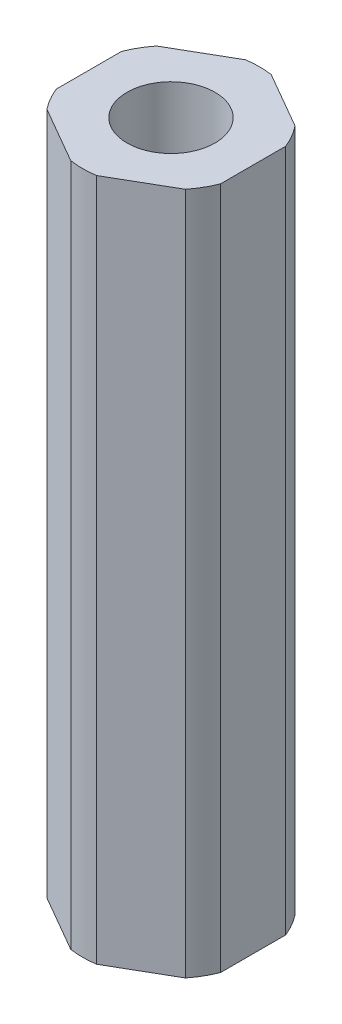
ISO-10303-21;
HEADER;
FILE_DESCRIPTION(('STEP AP214'),'2;1');
FILE_NAME('part.step','',(''),(''),'','','');
FILE_SCHEMA(('AUTOMOTIVE_DESIGN { 1 0 10303 214 1 1 1 1 }'));
ENDSEC;
DATA;
#1=APPLICATION_CONTEXT('core data for automotive mechanical design processes');
#2=APPLICATION_PROTOCOL_DEFINITION('international standard','automotive_design',2000,#1);
#3=PRODUCT_CONTEXT('',#1,'mechanical');
#4=PRODUCT('Part','Part','',(#3));
#5=PRODUCT_RELATED_PRODUCT_CATEGORY('part','',(#4));
#6=PRODUCT_DEFINITION_FORMATION('','',#4);
#7=PRODUCT_DEFINITION_CONTEXT('part definition',#1,'design');
#8=PRODUCT_DEFINITION('design','',#6,#7);
#9=PRODUCT_DEFINITION_SHAPE('','',#8);
#10=(LENGTH_UNIT() NAMED_UNIT(*) SI_UNIT(.MILLI.,.METRE.));
#11=(NAMED_UNIT(*) PLANE_ANGLE_UNIT() SI_UNIT($,.RADIAN.));
#12=(NAMED_UNIT(*) SI_UNIT($,.STERADIAN.) SOLID_ANGLE_UNIT());
#13=UNCERTAINTY_MEASURE_WITH_UNIT(LENGTH_MEASURE(1.E-05),#10,'distance_accuracy_value','');
#14=(GEOMETRIC_REPRESENTATION_CONTEXT(3) GLOBAL_UNCERTAINTY_ASSIGNED_CONTEXT((#13)) GLOBAL_UNIT_ASSIGNED_CONTEXT((#10,
#11,#12)) REPRESENTATION_CONTEXT('',''));
#15=CARTESIAN_POINT('',(0.,0.,0.));
#16=DIRECTION('',(0.,0.,1.));
#17=DIRECTION('',(1.,0.,0.));
#18=AXIS2_PLACEMENT_3D('',#15,#16,#17);
#19=CARTESIAN_POINT('',(-0.74297768918748,39.624,-5.07030294517691));
#20=DIRECTION('',(0.5,0.,0.866025403784439));
#21=DIRECTION('',(0.866025403784439,0.,-0.5));
#22=AXIS2_PLACEMENT_3D('',#19,#20,#21);
#23=PLANE('',#22);
#24=DIRECTION('',(-0.866025403784439,0.,0.5));
#25=VECTOR('',#24,1.);
#26=CARTESIAN_POINT('',(-0.74297768918748,0.,-5.07030294517691));
#27=LINE('',#26,#25);
#28=CARTESIAN_POINT('',(-0.742977689187479,0.,-5.07030294517691));
#29=VERTEX_POINT('',#28);
#30=CARTESIAN_POINT('',(-4.01952231081252,0.,-3.17858902586987));
#31=VERTEX_POINT('',#30);
#32=EDGE_CURVE('E157',#29,#31,#27,.T.);
#33=ORIENTED_EDGE('',*,*,#32,.T.);
#34=DIRECTION('',(0.,-1.,0.));
#35=VECTOR('',#34,1.);
#36=CARTESIAN_POINT('',(-4.01952231081252,39.624,-3.17858902586987));
#37=LINE('',#36,#35);
#38=CARTESIAN_POINT('',(-4.01952231081252,39.624,-3.17858902586987));
#39=VERTEX_POINT('',#38);
#40=EDGE_CURVE('E11',#39,#31,#37,.T.);
#41=ORIENTED_EDGE('',*,*,#40,.F.);
#42=DIRECTION('',(-0.866025403784439,0.,0.5));
#43=VECTOR('',#42,1.);
#44=CARTESIAN_POINT('',(-0.74297768918748,39.624,-5.07030294517691));
#45=LINE('',#44,#43);
#46=CARTESIAN_POINT('',(-0.742977689187479,39.624,-5.07030294517691));
#47=VERTEX_POINT('',#46);
#48=EDGE_CURVE('E180',#47,#39,#45,.T.);
#49=ORIENTED_EDGE('',*,*,#48,.F.);
#50=DIRECTION('',(0.,-1.,0.));
#51=VECTOR('',#50,1.);
#52=CARTESIAN_POINT('',(-0.742977689187479,39.624,-5.07030294517691));
#53=LINE('',#52,#51);
#54=EDGE_CURVE('E153',#47,#29,#53,.T.);
#55=ORIENTED_EDGE('',*,*,#54,.T.);
#56=EDGE_LOOP('',(#33,#41,#49,#55));
#57=FACE_BOUND('',#56,.T.);
#58=ADVANCED_FACE('F37',(#57),#23,.F.);
#59=CARTESIAN_POINT('',(0.,39.624,0.));
#60=DIRECTION('',(0.,-1.,0.));
#61=DIRECTION('',(0.,0.,-1.));
#62=AXIS2_PLACEMENT_3D('',#59,#60,#61);
#63=CYLINDRICAL_SURFACE('',#62,5.12445);
#64=CARTESIAN_POINT('',(0.,0.,0.));
#65=DIRECTION('',(0.,1.,0.));
#66=DIRECTION('',(0.,0.,1.));
#67=AXIS2_PLACEMENT_3D('',#64,#65,#66);
#68=CIRCLE('',#67,5.12445);
#69=CARTESIAN_POINT('',(-4.7625,0.,-1.89171391930704));
#70=VERTEX_POINT('',#69);
#71=EDGE_CURVE('E160',#31,#70,#68,.T.);
#72=ORIENTED_EDGE('',*,*,#71,.T.);
#73=DIRECTION('',(0.,-1.,0.));
#74=VECTOR('',#73,1.);
#75=CARTESIAN_POINT('',(-4.7625,39.624,-1.89171391930704));
#76=LINE('',#75,#74);
#77=CARTESIAN_POINT('',(-4.7625,39.624,-1.89171391930704));
#78=VERTEX_POINT('',#77);
#79=EDGE_CURVE('E45',#78,#70,#76,.T.);
#80=ORIENTED_EDGE('',*,*,#79,.F.);
#81=CARTESIAN_POINT('',(0.,39.624,0.));
#82=DIRECTION('',(0.,1.,0.));
#83=DIRECTION('',(0.,0.,1.));
#84=AXIS2_PLACEMENT_3D('',#81,#82,#83);
#85=CIRCLE('',#84,5.12445);
#86=EDGE_CURVE('E108',#39,#78,#85,.T.);
#87=ORIENTED_EDGE('',*,*,#86,.F.);
#88=ORIENTED_EDGE('',*,*,#40,.T.);
#89=EDGE_LOOP('',(#72,#80,#87,#88));
#90=FACE_BOUND('',#89,.T.);
#91=ADVANCED_FACE('F259',(#90),#63,.T.);
#92=CARTESIAN_POINT('',(-4.7625,39.624,-1.89171391930704));
#93=DIRECTION('',(1.,0.,0.));
#94=DIRECTION('',(0.,0.,-1.));
#95=AXIS2_PLACEMENT_3D('',#92,#93,#94);
#96=PLANE('',#95);
#97=DIRECTION('',(0.,0.,1.));
#98=VECTOR('',#97,1.);
#99=CARTESIAN_POINT('',(-4.7625,0.,-1.89171391930704));
#100=LINE('',#99,#98);
#101=CARTESIAN_POINT('',(-4.7625,0.,1.89171391930704));
#102=VERTEX_POINT('',#101);
#103=EDGE_CURVE('E163',#70,#102,#100,.T.);
#104=ORIENTED_EDGE('',*,*,#103,.T.);
#105=DIRECTION('',(0.,-1.,0.));
#106=VECTOR('',#105,1.);
#107=CARTESIAN_POINT('',(-4.7625,39.624,1.89171391930704));
#108=LINE('',#107,#106);
#109=CARTESIAN_POINT('',(-4.7625,39.624,1.89171391930704));
#110=VERTEX_POINT('',#109);
#111=EDGE_CURVE('E199',#110,#102,#108,.T.);
#112=ORIENTED_EDGE('',*,*,#111,.F.);
#113=DIRECTION('',(0.,0.,1.));
#114=VECTOR('',#113,1.);
#115=CARTESIAN_POINT('',(-4.7625,39.624,-1.89171391930704));
#116=LINE('',#115,#114);
#117=EDGE_CURVE('E207',#78,#110,#116,.T.);
#118=ORIENTED_EDGE('',*,*,#117,.F.);
#119=ORIENTED_EDGE('',*,*,#79,.T.);
#120=EDGE_LOOP('',(#104,#112,#118,#119));
#121=FACE_BOUND('',#120,.T.);
#122=ADVANCED_FACE('F205',(#121),#96,.F.);
#123=CARTESIAN_POINT('',(0.,39.624,0.));
#124=DIRECTION('',(0.,-1.,0.));
#125=DIRECTION('',(0.,0.,-1.));
#126=AXIS2_PLACEMENT_3D('',#123,#124,#125);
#127=CYLINDRICAL_SURFACE('',#126,5.12445);
#128=CARTESIAN_POINT('',(0.,0.,0.));
#129=DIRECTION('',(0.,1.,0.));
#130=DIRECTION('',(0.,0.,1.));
#131=AXIS2_PLACEMENT_3D('',#128,#129,#130);
#132=CIRCLE('',#131,5.12445);
#133=CARTESIAN_POINT('',(-4.01952231081252,0.,3.17858902586988));
#134=VERTEX_POINT('',#133);
#135=EDGE_CURVE('E165',#102,#134,#132,.T.);
#136=ORIENTED_EDGE('',*,*,#135,.T.);
#137=DIRECTION('',(0.,-1.,0.));
#138=VECTOR('',#137,1.);
#139=CARTESIAN_POINT('',(-4.01952231081252,39.624,3.17858902586988));
#140=LINE('',#139,#138);
#141=CARTESIAN_POINT('',(-4.01952231081252,39.624,3.17858902586988));
#142=VERTEX_POINT('',#141);
#143=EDGE_CURVE('E196',#142,#134,#140,.T.);
#144=ORIENTED_EDGE('',*,*,#143,.F.);
#145=CARTESIAN_POINT('',(0.,39.624,0.));
#146=DIRECTION('',(0.,1.,0.));
#147=DIRECTION('',(0.,0.,1.));
#148=AXIS2_PLACEMENT_3D('',#145,#146,#147);
#149=CIRCLE('',#148,5.12445);
#150=EDGE_CURVE('E225',#110,#142,#149,.T.);
#151=ORIENTED_EDGE('',*,*,#150,.F.);
#152=ORIENTED_EDGE('',*,*,#111,.T.);
#153=EDGE_LOOP('',(#136,#144,#151,#152));
#154=FACE_BOUND('',#153,.T.);
#155=ADVANCED_FACE('F216',(#154),#127,.T.);
#156=CARTESIAN_POINT('',(-4.01952231081252,39.624,3.17858902586988));
#157=DIRECTION('',(0.499999999999999,0.,-0.866025403784439));
#158=DIRECTION('',(-0.866025403784439,0.,-0.499999999999999));
#159=AXIS2_PLACEMENT_3D('',#156,#157,#158);
#160=PLANE('',#159);
#161=DIRECTION('',(0.866025403784439,0.,0.499999999999999));
#162=VECTOR('',#161,1.);
#163=CARTESIAN_POINT('',(-4.01952231081252,0.,3.17858902586988));
#164=LINE('',#163,#162);
#165=CARTESIAN_POINT('',(-0.74297768918748,0.,5.07030294517691));
#166=VERTEX_POINT('',#165);
#167=EDGE_CURVE('E167',#134,#166,#164,.T.);
#168=ORIENTED_EDGE('',*,*,#167,.T.);
#169=DIRECTION('',(0.,-1.,0.));
#170=VECTOR('',#169,1.);
#171=CARTESIAN_POINT('',(-0.74297768918748,39.624,5.07030294517691));
#172=LINE('',#171,#170);
#173=CARTESIAN_POINT('',(-0.74297768918748,39.624,5.07030294517691));
#174=VERTEX_POINT('',#173);
#175=EDGE_CURVE('E193',#174,#166,#172,.T.);
#176=ORIENTED_EDGE('',*,*,#175,.F.);
#177=DIRECTION('',(0.866025403784439,0.,0.499999999999999));
#178=VECTOR('',#177,1.);
#179=CARTESIAN_POINT('',(-4.01952231081252,39.624,3.17858902586988));
#180=LINE('',#179,#178);
#181=EDGE_CURVE('E222',#142,#174,#180,.T.);
#182=ORIENTED_EDGE('',*,*,#181,.F.);
#183=ORIENTED_EDGE('',*,*,#143,.T.);
#184=EDGE_LOOP('',(#168,#176,#182,#183));
#185=FACE_BOUND('',#184,.T.);
#186=ADVANCED_FACE('F220',(#185),#160,.F.);
#187=CARTESIAN_POINT('',(0.,39.624,0.));
#188=DIRECTION('',(0.,-1.,0.));
#189=DIRECTION('',(0.,0.,-1.));
#190=AXIS2_PLACEMENT_3D('',#187,#188,#189);
#191=CYLINDRICAL_SURFACE('',#190,5.12445);
#192=CARTESIAN_POINT('',(0.,0.,0.));
#193=DIRECTION('',(0.,1.,0.));
#194=DIRECTION('',(0.,0.,1.));
#195=AXIS2_PLACEMENT_3D('',#192,#193,#194);
#196=CIRCLE('',#195,5.12445);
#197=CARTESIAN_POINT('',(0.74297768918748,0.,5.07030294517691));
#198=VERTEX_POINT('',#197);
#199=EDGE_CURVE('E169',#166,#198,#196,.T.);
#200=ORIENTED_EDGE('',*,*,#199,.T.);
#201=DIRECTION('',(0.,-1.,0.));
#202=VECTOR('',#201,1.);
#203=CARTESIAN_POINT('',(0.74297768918748,39.624,5.07030294517691));
#204=LINE('',#203,#202);
#205=CARTESIAN_POINT('',(0.74297768918748,39.624,5.07030294517691));
#206=VERTEX_POINT('',#205);
#207=EDGE_CURVE('E190',#206,#198,#204,.T.);
#208=ORIENTED_EDGE('',*,*,#207,.F.);
#209=CARTESIAN_POINT('',(0.,39.624,0.));
#210=DIRECTION('',(0.,1.,0.));
#211=DIRECTION('',(0.,0.,1.));
#212=AXIS2_PLACEMENT_3D('',#209,#210,#211);
#213=CIRCLE('',#212,5.12445);
#214=EDGE_CURVE('E224',#174,#206,#213,.T.);
#215=ORIENTED_EDGE('',*,*,#214,.F.);
#216=ORIENTED_EDGE('',*,*,#175,.T.);
#217=EDGE_LOOP('',(#200,#208,#215,#216));
#218=FACE_BOUND('',#217,.T.);
#219=ADVANCED_FACE('F272',(#218),#191,.T.);
#220=CARTESIAN_POINT('',(0.742977689187481,39.624,5.07030294517691));
#221=DIRECTION('',(-0.5,0.,-0.866025403784438));
#222=DIRECTION('',(-0.866025403784439,0.,0.5));
#223=AXIS2_PLACEMENT_3D('',#220,#221,#222);
#224=PLANE('',#223);
#225=DIRECTION('',(0.866025403784438,0.,-0.5));
#226=VECTOR('',#225,1.);
#227=CARTESIAN_POINT('',(0.742977689187481,0.,5.07030294517691));
#228=LINE('',#227,#226);
#229=CARTESIAN_POINT('',(4.01952231081252,0.,3.17858902586987));
#230=VERTEX_POINT('',#229);
#231=EDGE_CURVE('E171',#198,#230,#228,.T.);
#232=ORIENTED_EDGE('',*,*,#231,.T.);
#233=DIRECTION('',(0.,-1.,0.));
#234=VECTOR('',#233,1.);
#235=CARTESIAN_POINT('',(4.01952231081252,39.624,3.17858902586987));
#236=LINE('',#235,#234);
#237=CARTESIAN_POINT('',(4.01952231081252,39.624,3.17858902586987));
#238=VERTEX_POINT('',#237);
#239=EDGE_CURVE('E187',#238,#230,#236,.T.);
#240=ORIENTED_EDGE('',*,*,#239,.F.);
#241=DIRECTION('',(0.866025403784438,0.,-0.5));
#242=VECTOR('',#241,1.);
#243=CARTESIAN_POINT('',(0.742977689187481,39.624,5.07030294517691));
#244=LINE('',#243,#242);
#245=EDGE_CURVE('E227',#206,#238,#244,.T.);
#246=ORIENTED_EDGE('',*,*,#245,.F.);
#247=ORIENTED_EDGE('',*,*,#207,.T.);
#248=EDGE_LOOP('',(#232,#240,#246,#247));
#249=FACE_BOUND('',#248,.T.);
#250=ADVANCED_FACE('F275',(#249),#224,.F.);
#251=CARTESIAN_POINT('',(0.,39.624,0.));
#252=DIRECTION('',(0.,-1.,0.));
#253=DIRECTION('',(0.,0.,-1.));
#254=AXIS2_PLACEMENT_3D('',#251,#252,#253);
#255=CYLINDRICAL_SURFACE('',#254,5.12445);
#256=CARTESIAN_POINT('',(0.,0.,0.));
#257=DIRECTION('',(0.,1.,0.));
#258=DIRECTION('',(0.,0.,1.));
#259=AXIS2_PLACEMENT_3D('',#256,#257,#258);
#260=CIRCLE('',#259,5.12445);
#261=CARTESIAN_POINT('',(4.7625,0.,1.89171391930703));
#262=VERTEX_POINT('',#261);
#263=EDGE_CURVE('E173',#230,#262,#260,.T.);
#264=ORIENTED_EDGE('',*,*,#263,.T.);
#265=DIRECTION('',(0.,-1.,0.));
#266=VECTOR('',#265,1.);
#267=CARTESIAN_POINT('',(4.7625,39.624,1.89171391930703));
#268=LINE('',#267,#266);
#269=CARTESIAN_POINT('',(4.7625,39.624,1.89171391930703));
#270=VERTEX_POINT('',#269);
#271=EDGE_CURVE('E184',#270,#262,#268,.T.);
#272=ORIENTED_EDGE('',*,*,#271,.F.);
#273=CARTESIAN_POINT('',(0.,39.624,0.));
#274=DIRECTION('',(0.,1.,0.));
#275=DIRECTION('',(0.,0.,1.));
#276=AXIS2_PLACEMENT_3D('',#273,#274,#275);
#277=CIRCLE('',#276,5.12445);
#278=EDGE_CURVE('E233',#238,#270,#277,.T.);
#279=ORIENTED_EDGE('',*,*,#278,.F.);
#280=ORIENTED_EDGE('',*,*,#239,.T.);
#281=EDGE_LOOP('',(#264,#272,#279,#280));
#282=FACE_BOUND('',#281,.T.);
#283=ADVANCED_FACE('F239',(#282),#255,.T.);
#284=CARTESIAN_POINT('',(4.7625,39.624,1.89171391930703));
#285=DIRECTION('',(-1.,0.,0.));
#286=DIRECTION('',(0.,0.,1.));
#287=AXIS2_PLACEMENT_3D('',#284,#285,#286);
#288=PLANE('',#287);
#289=DIRECTION('',(0.,0.,-1.));
#290=VECTOR('',#289,1.);
#291=CARTESIAN_POINT('',(4.7625,0.,1.89171391930703));
#292=LINE('',#291,#290);
#293=CARTESIAN_POINT('',(4.7625,0.,-1.89171391930704));
#294=VERTEX_POINT('',#293);
#295=EDGE_CURVE('E175',#262,#294,#292,.T.);
#296=ORIENTED_EDGE('',*,*,#295,.T.);
#297=DIRECTION('',(0.,-1.,0.));
#298=VECTOR('',#297,1.);
#299=CARTESIAN_POINT('',(4.7625,39.624,-1.89171391930704));
#300=LINE('',#299,#298);
#301=CARTESIAN_POINT('',(4.7625,39.624,-1.89171391930704));
#302=VERTEX_POINT('',#301);
#303=EDGE_CURVE('E148',#302,#294,#300,.T.);
#304=ORIENTED_EDGE('',*,*,#303,.F.);
#305=DIRECTION('',(0.,0.,-1.));
#306=VECTOR('',#305,1.);
#307=CARTESIAN_POINT('',(4.7625,39.624,1.89171391930703));
#308=LINE('',#307,#306);
#309=EDGE_CURVE('E139',#270,#302,#308,.T.);
#310=ORIENTED_EDGE('',*,*,#309,.F.);
#311=ORIENTED_EDGE('',*,*,#271,.T.);
#312=EDGE_LOOP('',(#296,#304,#310,#311));
#313=FACE_BOUND('',#312,.T.);
#314=ADVANCED_FACE('F243',(#313),#288,.F.);
#315=CARTESIAN_POINT('',(0.,39.624,0.));
#316=DIRECTION('',(0.,-1.,0.));
#317=DIRECTION('',(0.,0.,-1.));
#318=AXIS2_PLACEMENT_3D('',#315,#316,#317);
#319=CYLINDRICAL_SURFACE('',#318,5.12445);
#320=CARTESIAN_POINT('',(0.,0.,0.));
#321=DIRECTION('',(0.,1.,0.));
#322=DIRECTION('',(0.,0.,1.));
#323=AXIS2_PLACEMENT_3D('',#320,#321,#322);
#324=CIRCLE('',#323,5.12445);
#325=CARTESIAN_POINT('',(4.01952231081252,0.,-3.17858902586987));
#326=VERTEX_POINT('',#325);
#327=EDGE_CURVE('E147',#294,#326,#324,.T.);
#328=ORIENTED_EDGE('',*,*,#327,.T.);
#329=DIRECTION('',(0.,-1.,0.));
#330=VECTOR('',#329,1.);
#331=CARTESIAN_POINT('',(4.01952231081252,39.624,-3.17858902586987));
#332=LINE('',#331,#330);
#333=CARTESIAN_POINT('',(4.01952231081252,39.624,-3.17858902586987));
#334=VERTEX_POINT('',#333);
#335=EDGE_CURVE('E144',#334,#326,#332,.T.);
#336=ORIENTED_EDGE('',*,*,#335,.F.);
#337=CARTESIAN_POINT('',(0.,39.624,0.));
#338=DIRECTION('',(0.,1.,0.));
#339=DIRECTION('',(0.,0.,1.));
#340=AXIS2_PLACEMENT_3D('',#337,#338,#339);
#341=CIRCLE('',#340,5.12445);
#342=EDGE_CURVE('E133',#302,#334,#341,.T.);
#343=ORIENTED_EDGE('',*,*,#342,.F.);
#344=ORIENTED_EDGE('',*,*,#303,.T.);
#345=EDGE_LOOP('',(#328,#336,#343,#344));
#346=FACE_BOUND('',#345,.T.);
#347=ADVANCED_FACE('F145',(#346),#319,.T.);
#348=CARTESIAN_POINT('',(4.01952231081252,39.624,-3.17858902586987));
#349=DIRECTION('',(-0.5,0.,0.866025403784439));
#350=DIRECTION('',(0.866025403784439,0.,0.5));
#351=AXIS2_PLACEMENT_3D('',#348,#349,#350);
#352=PLANE('',#351);
#353=DIRECTION('',(-0.866025403784439,0.,-0.5));
#354=VECTOR('',#353,1.);
#355=CARTESIAN_POINT('',(4.01952231081252,0.,-3.17858902586987));
#356=LINE('',#355,#354);
#357=CARTESIAN_POINT('',(0.742977689187475,0.,-5.07030294517691));
#358=VERTEX_POINT('',#357);
#359=EDGE_CURVE('E94',#326,#358,#356,.T.);
#360=ORIENTED_EDGE('',*,*,#359,.T.);
#361=DIRECTION('',(0.,-1.,0.));
#362=VECTOR('',#361,1.);
#363=CARTESIAN_POINT('',(0.742977689187475,39.624,-5.07030294517691));
#364=LINE('',#363,#362);
#365=CARTESIAN_POINT('',(0.742977689187475,39.624,-5.07030294517691));
#366=VERTEX_POINT('',#365);
#367=EDGE_CURVE('E149',#366,#358,#364,.T.);
#368=ORIENTED_EDGE('',*,*,#367,.F.);
#369=DIRECTION('',(-0.866025403784439,0.,-0.5));
#370=VECTOR('',#369,1.);
#371=CARTESIAN_POINT('',(4.01952231081252,39.624,-3.17858902586987));
#372=LINE('',#371,#370);
#373=EDGE_CURVE('E137',#334,#366,#372,.T.);
#374=ORIENTED_EDGE('',*,*,#373,.F.);
#375=ORIENTED_EDGE('',*,*,#335,.T.);
#376=EDGE_LOOP('',(#360,#368,#374,#375));
#377=FACE_BOUND('',#376,.T.);
#378=ADVANCED_FACE('F151',(#377),#352,.F.);
#379=CARTESIAN_POINT('',(0.,39.624,0.));
#380=DIRECTION('',(0.,-1.,0.));
#381=DIRECTION('',(0.,0.,-1.));
#382=AXIS2_PLACEMENT_3D('',#379,#380,#381);
#383=CYLINDRICAL_SURFACE('',#382,5.12445);
#384=CARTESIAN_POINT('',(0.,0.,0.));
#385=DIRECTION('',(0.,1.,0.));
#386=DIRECTION('',(0.,0.,1.));
#387=AXIS2_PLACEMENT_3D('',#384,#385,#386);
#388=CIRCLE('',#387,5.12445);
#389=EDGE_CURVE('E100',#358,#29,#388,.T.);
#390=ORIENTED_EDGE('',*,*,#389,.T.);
#391=ORIENTED_EDGE('',*,*,#54,.F.);
#392=CARTESIAN_POINT('',(0.,39.624,0.));
#393=DIRECTION('',(0.,1.,0.));
#394=DIRECTION('',(0.,0.,1.));
#395=AXIS2_PLACEMENT_3D('',#392,#393,#394);
#396=CIRCLE('',#395,5.12445);
#397=EDGE_CURVE('E53',#366,#47,#396,.T.);
#398=ORIENTED_EDGE('',*,*,#397,.F.);
#399=ORIENTED_EDGE('',*,*,#367,.T.);
#400=EDGE_LOOP('',(#390,#391,#398,#399));
#401=FACE_BOUND('',#400,.T.);
#402=ADVANCED_FACE('F247',(#401),#383,.T.);
#403=CARTESIAN_POINT('',(0.,39.624,0.));
#404=DIRECTION('',(0.,1.,0.));
#405=DIRECTION('',(0.,0.,1.));
#406=AXIS2_PLACEMENT_3D('',#403,#404,#405);
#407=PLANE('',#406);
#408=CARTESIAN_POINT('',(0.,39.624,0.));
#409=DIRECTION('',(0.,1.,0.));
#410=DIRECTION('',(0.,0.,1.));
#411=AXIS2_PLACEMENT_3D('',#408,#409,#410);
#412=CIRCLE('',#411,2.5527);
#413=CARTESIAN_POINT('',(0.,39.624,2.5527));
#414=VERTEX_POINT('',#413);
#415=EDGE_CURVE('E410',#414,#414,#412,.T.);
#416=ORIENTED_EDGE('',*,*,#415,.F.);
#417=EDGE_LOOP('',(#416));
#418=FACE_BOUND('',#417,.T.);
#419=ORIENTED_EDGE('',*,*,#48,.T.);
#420=ORIENTED_EDGE('',*,*,#86,.T.);
#421=ORIENTED_EDGE('',*,*,#117,.T.);
#422=ORIENTED_EDGE('',*,*,#150,.T.);
#423=ORIENTED_EDGE('',*,*,#181,.T.);
#424=ORIENTED_EDGE('',*,*,#214,.T.);
#425=ORIENTED_EDGE('',*,*,#245,.T.);
#426=ORIENTED_EDGE('',*,*,#278,.T.);
#427=ORIENTED_EDGE('',*,*,#309,.T.);
#428=ORIENTED_EDGE('',*,*,#342,.T.);
#429=ORIENTED_EDGE('',*,*,#373,.T.);
#430=ORIENTED_EDGE('',*,*,#397,.T.);
#431=EDGE_LOOP('',(#419,#420,#421,#422,#423,#424,#425,#426,#427,#428,#429,#430));
#432=FACE_BOUND('',#431,.T.);
#433=ADVANCED_FACE('F135',(#418,#432),#407,.T.);
#434=CARTESIAN_POINT('',(0.,0.,0.));
#435=DIRECTION('',(0.,1.,0.));
#436=DIRECTION('',(0.,0.,1.));
#437=AXIS2_PLACEMENT_3D('',#434,#435,#436);
#438=PLANE('',#437);
#439=CARTESIAN_POINT('',(0.,0.,0.));
#440=DIRECTION('',(0.,1.,0.));
#441=DIRECTION('',(0.,0.,1.));
#442=AXIS2_PLACEMENT_3D('',#439,#440,#441);
#443=CIRCLE('',#442,2.5527);
#444=CARTESIAN_POINT('',(0.,0.,2.5527));
#445=VERTEX_POINT('',#444);
#446=EDGE_CURVE('E161',#445,#445,#443,.T.);
#447=ORIENTED_EDGE('',*,*,#446,.T.);
#448=EDGE_LOOP('',(#447));
#449=FACE_BOUND('',#448,.T.);
#450=ORIENTED_EDGE('',*,*,#32,.F.);
#451=ORIENTED_EDGE('',*,*,#389,.F.);
#452=ORIENTED_EDGE('',*,*,#359,.F.);
#453=ORIENTED_EDGE('',*,*,#327,.F.);
#454=ORIENTED_EDGE('',*,*,#295,.F.);
#455=ORIENTED_EDGE('',*,*,#263,.F.);
#456=ORIENTED_EDGE('',*,*,#231,.F.);
#457=ORIENTED_EDGE('',*,*,#199,.F.);
#458=ORIENTED_EDGE('',*,*,#167,.F.);
#459=ORIENTED_EDGE('',*,*,#135,.F.);
#460=ORIENTED_EDGE('',*,*,#103,.F.);
#461=ORIENTED_EDGE('',*,*,#71,.F.);
#462=EDGE_LOOP('',(#450,#451,#452,#453,#454,#455,#456,#457,#458,#459,#460,#461));
#463=FACE_BOUND('',#462,.T.);
#464=ADVANCED_FACE('F211',(#449,#463),#438,.F.);
#465=CARTESIAN_POINT('',(0.,0.,0.));
#466=DIRECTION('',(0.,1.,0.));
#467=DIRECTION('',(0.,0.,1.));
#468=AXIS2_PLACEMENT_3D('',#465,#466,#467);
#469=CYLINDRICAL_SURFACE('',#468,2.5527);
#470=ORIENTED_EDGE('',*,*,#446,.F.);
#471=EDGE_LOOP('',(#470));
#472=FACE_BOUND('',#471,.T.);
#473=ORIENTED_EDGE('',*,*,#415,.T.);
#474=EDGE_LOOP('',(#473));
#475=FACE_BOUND('',#474,.T.);
#476=ADVANCED_FACE('F315',(#472,#475),#469,.F.);
#477=CLOSED_SHELL('',(#58,#91,#122,#155,#186,#219,#250,#283,#314,#347,#378,#402,#433,#464,#476));
#478=MANIFOLD_SOLID_BREP('B2',#477);
#479=ADVANCED_BREP_SHAPE_REPRESENTATION('',(#18,#478),#14);
#480=SHAPE_DEFINITION_REPRESENTATION(#9,#479);
ENDSEC;
END-ISO-10303-21;
